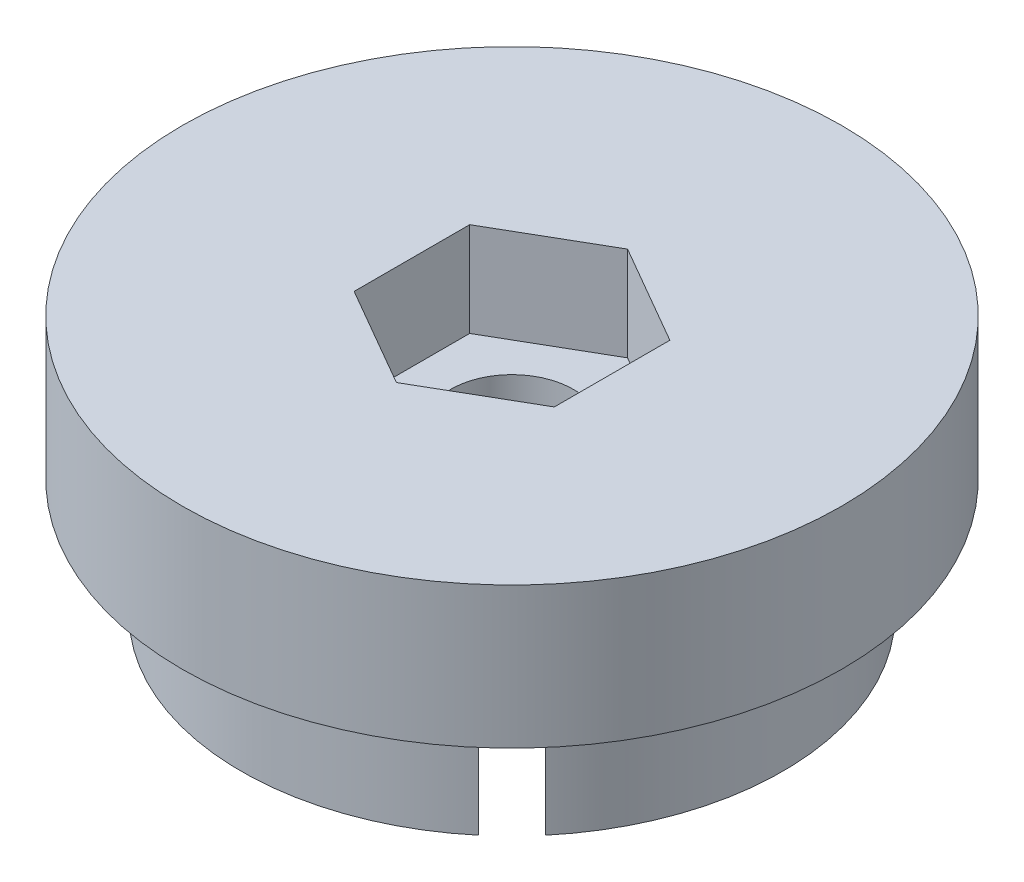
ISO-10303-21;
HEADER;
FILE_DESCRIPTION(('STEP AP214'),'2;1');
FILE_NAME('part.step','',(''),(''),'','','');
FILE_SCHEMA(('AUTOMOTIVE_DESIGN { 1 0 10303 214 1 1 1 1 }'));
ENDSEC;
DATA;
#1=APPLICATION_CONTEXT('core data for automotive mechanical design processes');
#2=APPLICATION_PROTOCOL_DEFINITION('international standard','automotive_design',2000,#1);
#3=PRODUCT_CONTEXT('',#1,'mechanical');
#4=PRODUCT('Part','Part','',(#3));
#5=PRODUCT_RELATED_PRODUCT_CATEGORY('part','',(#4));
#6=PRODUCT_DEFINITION_FORMATION('','',#4);
#7=PRODUCT_DEFINITION_CONTEXT('part definition',#1,'design');
#8=PRODUCT_DEFINITION('design','',#6,#7);
#9=PRODUCT_DEFINITION_SHAPE('','',#8);
#10=(LENGTH_UNIT() NAMED_UNIT(*) SI_UNIT(.MILLI.,.METRE.));
#11=(NAMED_UNIT(*) PLANE_ANGLE_UNIT() SI_UNIT($,.RADIAN.));
#12=(NAMED_UNIT(*) SI_UNIT($,.STERADIAN.) SOLID_ANGLE_UNIT());
#13=UNCERTAINTY_MEASURE_WITH_UNIT(LENGTH_MEASURE(1.E-05),#10,'distance_accuracy_value','');
#14=(GEOMETRIC_REPRESENTATION_CONTEXT(3) GLOBAL_UNCERTAINTY_ASSIGNED_CONTEXT((#13)) GLOBAL_UNIT_ASSIGNED_CONTEXT((#10,
#11,#12)) REPRESENTATION_CONTEXT('',''));
#15=CARTESIAN_POINT('',(0.,0.,0.));
#16=DIRECTION('',(0.,0.,1.));
#17=DIRECTION('',(1.,0.,0.));
#18=AXIS2_PLACEMENT_3D('',#15,#16,#17);
#19=CARTESIAN_POINT('',(0.,0.,0.));
#20=DIRECTION('',(0.,1.,0.));
#21=DIRECTION('',(0.,0.,1.));
#22=AXIS2_PLACEMENT_3D('',#19,#20,#21);
#23=PLANE('',#22);
#24=DIRECTION('',(-0.707106781186548,0.,0.707106781186547));
#25=VECTOR('',#24,1.);
#26=CARTESIAN_POINT('',(-0.707106781186547,0.,-0.707106781186548));
#27=LINE('',#26,#25);
#28=CARTESIAN_POINT('',(-5.53921356237309,0.,4.125));
#29=VERTEX_POINT('',#28);
#30=CARTESIAN_POINT('',(-8.80803265419637,0.,7.39381909182328));
#31=VERTEX_POINT('',#30);
#32=EDGE_CURVE('E344',#29,#31,#27,.T.);
#33=ORIENTED_EDGE('',*,*,#32,.F.);
#34=DIRECTION('',(0.,0.,-1.));
#35=VECTOR('',#34,1.);
#36=CARTESIAN_POINT('',(-5.53921356237309,0.,0.));
#37=LINE('',#36,#35);
#38=CARTESIAN_POINT('',(-5.53921356237309,0.,-4.125));
#39=VERTEX_POINT('',#38);
#40=EDGE_CURVE('E363',#29,#39,#37,.T.);
#41=ORIENTED_EDGE('',*,*,#40,.T.);
#42=DIRECTION('',(0.707106781186546,0.,0.707106781186549));
#43=VECTOR('',#42,1.);
#44=CARTESIAN_POINT('',(-0.707106781186557,0.,0.707106781186554));
#45=LINE('',#44,#43);
#46=CARTESIAN_POINT('',(-8.80803265419637,0.,-7.39381909182329));
#47=VERTEX_POINT('',#46);
#48=EDGE_CURVE('E158',#47,#39,#45,.T.);
#49=ORIENTED_EDGE('',*,*,#48,.F.);
#50=CARTESIAN_POINT('',(0.,0.,0.));
#51=DIRECTION('',(0.,-1.,0.));
#52=DIRECTION('',(0.,0.,-1.));
#53=AXIS2_PLACEMENT_3D('',#50,#51,#52);
#54=CIRCLE('',#53,11.5);
#55=EDGE_CURVE('E359',#31,#47,#54,.T.);
#56=ORIENTED_EDGE('',*,*,#55,.F.);
#57=EDGE_LOOP('',(#33,#41,#49,#56));
#58=FACE_BOUND('',#57,.T.);
#59=DIRECTION('',(0.707106781186548,0.,-0.707106781186548));
#60=VECTOR('',#59,1.);
#61=CARTESIAN_POINT('',(0.707106781186549,0.,0.707106781186549));
#62=LINE('',#61,#60);
#63=CARTESIAN_POINT('',(5.5392135623731,0.,-4.125));
#64=VERTEX_POINT('',#63);
#65=CARTESIAN_POINT('',(8.80803265419637,0.,-7.39381909182327));
#66=VERTEX_POINT('',#65);
#67=EDGE_CURVE('E405',#64,#66,#62,.T.);
#68=ORIENTED_EDGE('',*,*,#67,.F.);
#69=DIRECTION('',(0.,0.,1.));
#70=VECTOR('',#69,1.);
#71=CARTESIAN_POINT('',(5.5392135623731,0.,0.));
#72=LINE('',#71,#70);
#73=CARTESIAN_POINT('',(5.5392135623731,0.,4.125));
#74=VERTEX_POINT('',#73);
#75=EDGE_CURVE('E424',#64,#74,#72,.T.);
#76=ORIENTED_EDGE('',*,*,#75,.T.);
#77=DIRECTION('',(-0.707106781186546,0.,-0.707106781186549));
#78=VECTOR('',#77,1.);
#79=CARTESIAN_POINT('',(0.707106781186556,0.,-0.707106781186554));
#80=LINE('',#79,#78);
#81=CARTESIAN_POINT('',(8.80803265419637,0.,7.39381909182328));
#82=VERTEX_POINT('',#81);
#83=EDGE_CURVE('E422',#82,#74,#80,.T.);
#84=ORIENTED_EDGE('',*,*,#83,.F.);
#85=CARTESIAN_POINT('',(0.,0.,0.));
#86=DIRECTION('',(0.,-1.,0.));
#87=DIRECTION('',(0.,0.,-1.));
#88=AXIS2_PLACEMENT_3D('',#85,#86,#87);
#89=CIRCLE('',#88,11.5);
#90=EDGE_CURVE('E419',#66,#82,#89,.T.);
#91=ORIENTED_EDGE('',*,*,#90,.F.);
#92=EDGE_LOOP('',(#68,#76,#84,#91));
#93=FACE_BOUND('',#92,.T.);
#94=CARTESIAN_POINT('',(0.,0.,0.));
#95=DIRECTION('',(0.,1.,0.));
#96=DIRECTION('',(0.,0.,1.));
#97=AXIS2_PLACEMENT_3D('',#94,#95,#96);
#98=CIRCLE('',#97,14.);
#99=CARTESIAN_POINT('',(0.,0.,14.));
#100=VERTEX_POINT('',#99);
#101=EDGE_CURVE('E488',#100,#100,#98,.T.);
#102=ORIENTED_EDGE('',*,*,#101,.F.);
#103=EDGE_LOOP('',(#102));
#104=FACE_BOUND('',#103,.T.);
#105=DIRECTION('',(-1.,0.,0.));
#106=VECTOR('',#105,1.);
#107=CARTESIAN_POINT('',(3.,0.,-3.));
#108=LINE('',#107,#106);
#109=CARTESIAN_POINT('',(3.,0.,-3.));
#110=VERTEX_POINT('',#109);
#111=CARTESIAN_POINT('',(-3.,0.,-3.));
#112=VERTEX_POINT('',#111);
#113=EDGE_CURVE('E498',#110,#112,#108,.T.);
#114=ORIENTED_EDGE('',*,*,#113,.T.);
#115=DIRECTION('',(0.,0.,1.));
#116=VECTOR('',#115,1.);
#117=CARTESIAN_POINT('',(-3.,0.,3.));
#118=LINE('',#117,#116);
#119=CARTESIAN_POINT('',(-3.,0.,3.));
#120=VERTEX_POINT('',#119);
#121=EDGE_CURVE('E493',#112,#120,#118,.T.);
#122=ORIENTED_EDGE('',*,*,#121,.T.);
#123=DIRECTION('',(1.,0.,0.));
#124=VECTOR('',#123,1.);
#125=CARTESIAN_POINT('',(3.,0.,3.));
#126=LINE('',#125,#124);
#127=CARTESIAN_POINT('',(3.,0.,3.));
#128=VERTEX_POINT('',#127);
#129=EDGE_CURVE('E510',#120,#128,#126,.T.);
#130=ORIENTED_EDGE('',*,*,#129,.T.);
#131=DIRECTION('',(0.,0.,-1.));
#132=VECTOR('',#131,1.);
#133=CARTESIAN_POINT('',(3.,0.,3.));
#134=LINE('',#133,#132);
#135=EDGE_CURVE('E513',#128,#110,#134,.T.);
#136=ORIENTED_EDGE('',*,*,#135,.T.);
#137=EDGE_LOOP('',(#114,#122,#130,#136));
#138=FACE_BOUND('',#137,.T.);
#139=DIRECTION('',(-0.707106781186547,0.,-0.707106781186548));
#140=VECTOR('',#139,1.);
#141=CARTESIAN_POINT('',(0.707106781186547,0.,-0.707106781186547));
#142=LINE('',#141,#140);
#143=CARTESIAN_POINT('',(-4.125,0.,-5.5392135623731));
#144=VERTEX_POINT('',#143);
#145=CARTESIAN_POINT('',(-7.39381909182327,0.,-8.80803265419637));
#146=VERTEX_POINT('',#145);
#147=EDGE_CURVE('E374',#144,#146,#142,.T.);
#148=ORIENTED_EDGE('',*,*,#147,.F.);
#149=DIRECTION('',(1.,0.,0.));
#150=VECTOR('',#149,1.);
#151=CARTESIAN_POINT('',(0.,0.,-5.5392135623731));
#152=LINE('',#151,#150);
#153=CARTESIAN_POINT('',(4.125,0.,-5.53921356237309));
#154=VERTEX_POINT('',#153);
#155=EDGE_CURVE('E393',#144,#154,#152,.T.);
#156=ORIENTED_EDGE('',*,*,#155,.T.);
#157=DIRECTION('',(-0.707106781186549,0.,0.707106781186546));
#158=VECTOR('',#157,1.);
#159=CARTESIAN_POINT('',(-0.707106781186552,0.,-0.707106781186554));
#160=LINE('',#159,#158);
#161=CARTESIAN_POINT('',(7.39381909182329,0.,-8.80803265419637));
#162=VERTEX_POINT('',#161);
#163=EDGE_CURVE('E391',#162,#154,#160,.T.);
#164=ORIENTED_EDGE('',*,*,#163,.F.);
#165=CARTESIAN_POINT('',(0.,0.,0.));
#166=DIRECTION('',(0.,-1.,0.));
#167=DIRECTION('',(0.,0.,-1.));
#168=AXIS2_PLACEMENT_3D('',#165,#166,#167);
#169=CIRCLE('',#168,11.5);
#170=EDGE_CURVE('E388',#146,#162,#169,.T.);
#171=ORIENTED_EDGE('',*,*,#170,.F.);
#172=EDGE_LOOP('',(#148,#156,#164,#171));
#173=FACE_BOUND('',#172,.T.);
#174=DIRECTION('',(0.707106781186547,0.,0.707106781186548));
#175=VECTOR('',#174,1.);
#176=CARTESIAN_POINT('',(-0.707106781186547,0.,0.707106781186546));
#177=LINE('',#176,#175);
#178=CARTESIAN_POINT('',(4.125,0.,5.53921356237309));
#179=VERTEX_POINT('',#178);
#180=CARTESIAN_POINT('',(7.39381909182327,0.,8.80803265419637));
#181=VERTEX_POINT('',#180);
#182=EDGE_CURVE('E324',#179,#181,#177,.T.);
#183=ORIENTED_EDGE('',*,*,#182,.F.);
#184=DIRECTION('',(-1.,0.,0.));
#185=VECTOR('',#184,1.);
#186=CARTESIAN_POINT('',(0.,0.,5.53921356237309));
#187=LINE('',#186,#185);
#188=CARTESIAN_POINT('',(-4.125,0.,5.5392135623731));
#189=VERTEX_POINT('',#188);
#190=EDGE_CURVE('E333',#179,#189,#187,.T.);
#191=ORIENTED_EDGE('',*,*,#190,.T.);
#192=DIRECTION('',(0.707106781186549,0.,-0.707106781186546));
#193=VECTOR('',#192,1.);
#194=CARTESIAN_POINT('',(0.707106781186554,0.,0.707106781186557));
#195=LINE('',#194,#193);
#196=CARTESIAN_POINT('',(-7.39381909182328,0.,8.80803265419637));
#197=VERTEX_POINT('',#196);
#198=EDGE_CURVE('E150',#197,#189,#195,.T.);
#199=ORIENTED_EDGE('',*,*,#198,.F.);
#200=CARTESIAN_POINT('',(0.,0.,0.));
#201=DIRECTION('',(0.,-1.,0.));
#202=DIRECTION('',(0.,0.,-1.));
#203=AXIS2_PLACEMENT_3D('',#200,#201,#202);
#204=CIRCLE('',#203,11.5);
#205=EDGE_CURVE('E316',#181,#197,#204,.T.);
#206=ORIENTED_EDGE('',*,*,#205,.F.);
#207=EDGE_LOOP('',(#183,#191,#199,#206));
#208=FACE_BOUND('',#207,.T.);
#209=ADVANCED_FACE('F133',(#58,#93,#104,#138,#173,#208),#23,.F.);
#210=CARTESIAN_POINT('',(0.,-5.,0.));
#211=DIRECTION('',(0.,1.,0.));
#212=DIRECTION('',(0.,0.,1.));
#213=AXIS2_PLACEMENT_3D('',#210,#211,#212);
#214=CYLINDRICAL_SURFACE('',#213,2.6);
#215=CARTESIAN_POINT('',(0.,-5.,0.));
#216=DIRECTION('',(0.,1.,0.));
#217=DIRECTION('',(0.,0.,1.));
#218=AXIS2_PLACEMENT_3D('',#215,#216,#217);
#219=CIRCLE('',#218,2.6);
#220=CARTESIAN_POINT('',(0.,-5.,2.6));
#221=VERTEX_POINT('',#220);
#222=EDGE_CURVE('E487',#221,#221,#219,.T.);
#223=ORIENTED_EDGE('',*,*,#222,.F.);
#224=EDGE_LOOP('',(#223));
#225=FACE_BOUND('',#224,.T.);
#226=CARTESIAN_POINT('',(0.,2.,0.));
#227=DIRECTION('',(0.,1.,0.));
#228=DIRECTION('',(0.,0.,1.));
#229=AXIS2_PLACEMENT_3D('',#226,#227,#228);
#230=CIRCLE('',#229,2.6);
#231=CARTESIAN_POINT('',(0.,2.,2.6));
#232=VERTEX_POINT('',#231);
#233=EDGE_CURVE('E137',#232,#232,#230,.F.);
#234=ORIENTED_EDGE('',*,*,#233,.F.);
#235=EDGE_LOOP('',(#234));
#236=FACE_BOUND('',#235,.T.);
#237=ADVANCED_FACE('F546',(#225,#236),#214,.F.);
#238=CARTESIAN_POINT('',(-3.,-5.,3.));
#239=DIRECTION('',(-1.,0.,0.));
#240=DIRECTION('',(0.,0.,1.));
#241=AXIS2_PLACEMENT_3D('',#238,#239,#240);
#242=PLANE('',#241);
#243=ORIENTED_EDGE('',*,*,#121,.F.);
#244=DIRECTION('',(0.,1.,0.));
#245=VECTOR('',#244,1.);
#246=CARTESIAN_POINT('',(-3.,-5.,-3.));
#247=LINE('',#246,#245);
#248=CARTESIAN_POINT('',(-3.,-5.,-3.));
#249=VERTEX_POINT('',#248);
#250=EDGE_CURVE('E12',#249,#112,#247,.T.);
#251=ORIENTED_EDGE('',*,*,#250,.F.);
#252=DIRECTION('',(0.,0.,1.));
#253=VECTOR('',#252,1.);
#254=CARTESIAN_POINT('',(-3.,-5.,3.));
#255=LINE('',#254,#253);
#256=CARTESIAN_POINT('',(-3.,-5.,3.));
#257=VERTEX_POINT('',#256);
#258=EDGE_CURVE('E494',#249,#257,#255,.T.);
#259=ORIENTED_EDGE('',*,*,#258,.T.);
#260=DIRECTION('',(0.,1.,0.));
#261=VECTOR('',#260,1.);
#262=CARTESIAN_POINT('',(-3.,-5.,3.));
#263=LINE('',#262,#261);
#264=EDGE_CURVE('E507',#257,#120,#263,.T.);
#265=ORIENTED_EDGE('',*,*,#264,.T.);
#266=EDGE_LOOP('',(#243,#251,#259,#265));
#267=FACE_BOUND('',#266,.T.);
#268=ADVANCED_FACE('F135',(#267),#242,.T.);
#269=CARTESIAN_POINT('',(3.,-5.,-3.));
#270=DIRECTION('',(0.,0.,-1.));
#271=DIRECTION('',(-1.,0.,0.));
#272=AXIS2_PLACEMENT_3D('',#269,#270,#271);
#273=PLANE('',#272);
#274=ORIENTED_EDGE('',*,*,#113,.F.);
#275=DIRECTION('',(0.,1.,0.));
#276=VECTOR('',#275,1.);
#277=CARTESIAN_POINT('',(3.,-5.,-3.));
#278=LINE('',#277,#276);
#279=CARTESIAN_POINT('',(3.,-5.,-3.));
#280=VERTEX_POINT('',#279);
#281=EDGE_CURVE('E142',#280,#110,#278,.T.);
#282=ORIENTED_EDGE('',*,*,#281,.F.);
#283=DIRECTION('',(-1.,0.,0.));
#284=VECTOR('',#283,1.);
#285=CARTESIAN_POINT('',(3.,-5.,-3.));
#286=LINE('',#285,#284);
#287=EDGE_CURVE('E504',#280,#249,#286,.T.);
#288=ORIENTED_EDGE('',*,*,#287,.T.);
#289=ORIENTED_EDGE('',*,*,#250,.T.);
#290=EDGE_LOOP('',(#274,#282,#288,#289));
#291=FACE_BOUND('',#290,.T.);
#292=ADVANCED_FACE('F531',(#291),#273,.T.);
#293=CARTESIAN_POINT('',(3.,-5.,3.));
#294=DIRECTION('',(1.,0.,0.));
#295=DIRECTION('',(0.,0.,-1.));
#296=AXIS2_PLACEMENT_3D('',#293,#294,#295);
#297=PLANE('',#296);
#298=ORIENTED_EDGE('',*,*,#135,.F.);
#299=DIRECTION('',(0.,1.,0.));
#300=VECTOR('',#299,1.);
#301=CARTESIAN_POINT('',(3.,-5.,3.));
#302=LINE('',#301,#300);
#303=CARTESIAN_POINT('',(3.,-5.,3.));
#304=VERTEX_POINT('',#303);
#305=EDGE_CURVE('E519',#304,#128,#302,.T.);
#306=ORIENTED_EDGE('',*,*,#305,.F.);
#307=DIRECTION('',(0.,0.,-1.));
#308=VECTOR('',#307,1.);
#309=CARTESIAN_POINT('',(3.,-5.,3.));
#310=LINE('',#309,#308);
#311=EDGE_CURVE('E501',#304,#280,#310,.T.);
#312=ORIENTED_EDGE('',*,*,#311,.T.);
#313=ORIENTED_EDGE('',*,*,#281,.T.);
#314=EDGE_LOOP('',(#298,#306,#312,#313));
#315=FACE_BOUND('',#314,.T.);
#316=ADVANCED_FACE('F537',(#315),#297,.T.);
#317=CARTESIAN_POINT('',(3.,-5.,3.));
#318=DIRECTION('',(0.,0.,1.));
#319=DIRECTION('',(1.,0.,0.));
#320=AXIS2_PLACEMENT_3D('',#317,#318,#319);
#321=PLANE('',#320);
#322=ORIENTED_EDGE('',*,*,#129,.F.);
#323=ORIENTED_EDGE('',*,*,#264,.F.);
#324=DIRECTION('',(1.,0.,0.));
#325=VECTOR('',#324,1.);
#326=CARTESIAN_POINT('',(3.,-5.,3.));
#327=LINE('',#326,#325);
#328=EDGE_CURVE('E497',#257,#304,#327,.T.);
#329=ORIENTED_EDGE('',*,*,#328,.T.);
#330=ORIENTED_EDGE('',*,*,#305,.T.);
#331=EDGE_LOOP('',(#322,#323,#329,#330));
#332=FACE_BOUND('',#331,.T.);
#333=ADVANCED_FACE('F525',(#332),#321,.T.);
#334=CARTESIAN_POINT('',(0.,-5.,0.));
#335=DIRECTION('',(0.,1.,0.));
#336=DIRECTION('',(0.,0.,1.));
#337=AXIS2_PLACEMENT_3D('',#334,#335,#336);
#338=PLANE('',#337);
#339=ORIENTED_EDGE('',*,*,#222,.T.);
#340=EDGE_LOOP('',(#339));
#341=FACE_BOUND('',#340,.T.);
#342=ORIENTED_EDGE('',*,*,#258,.F.);
#343=ORIENTED_EDGE('',*,*,#287,.F.);
#344=ORIENTED_EDGE('',*,*,#311,.F.);
#345=ORIENTED_EDGE('',*,*,#328,.F.);
#346=EDGE_LOOP('',(#342,#343,#344,#345));
#347=FACE_BOUND('',#346,.T.);
#348=ADVANCED_FACE('F534',(#341,#347),#338,.F.);
#349=CARTESIAN_POINT('',(0.,6.,0.));
#350=DIRECTION('',(0.,1.,0.));
#351=DIRECTION('',(0.,0.,1.));
#352=AXIS2_PLACEMENT_3D('',#349,#350,#351);
#353=PLANE('',#352);
#354=DIRECTION('',(-0.866025403784438,0.,-0.5));
#355=VECTOR('',#354,1.);
#356=CARTESIAN_POINT('',(4.25,6.,-2.45373864405591));
#357=LINE('',#356,#355);
#358=CARTESIAN_POINT('',(4.25,6.,-2.45373864405591));
#359=VERTEX_POINT('',#358);
#360=CARTESIAN_POINT('',(0.,6.,-4.90747728811182));
#361=VERTEX_POINT('',#360);
#362=EDGE_CURVE('E436',#359,#361,#357,.T.);
#363=ORIENTED_EDGE('',*,*,#362,.F.);
#364=DIRECTION('',(0.,0.,-1.));
#365=VECTOR('',#364,1.);
#366=CARTESIAN_POINT('',(4.25,6.,2.45373864405591));
#367=LINE('',#366,#365);
#368=CARTESIAN_POINT('',(4.25,6.,2.45373864405591));
#369=VERTEX_POINT('',#368);
#370=EDGE_CURVE('E441',#369,#359,#367,.T.);
#371=ORIENTED_EDGE('',*,*,#370,.F.);
#372=DIRECTION('',(0.866025403784439,0.,-0.5));
#373=VECTOR('',#372,1.);
#374=CARTESIAN_POINT('',(0.,6.,4.90747728811182));
#375=LINE('',#374,#373);
#376=CARTESIAN_POINT('',(0.,6.,4.90747728811182));
#377=VERTEX_POINT('',#376);
#378=EDGE_CURVE('E467',#377,#369,#375,.T.);
#379=ORIENTED_EDGE('',*,*,#378,.F.);
#380=DIRECTION('',(0.866025403784439,0.,0.5));
#381=VECTOR('',#380,1.);
#382=CARTESIAN_POINT('',(-4.25,6.,2.45373864405591));
#383=LINE('',#382,#381);
#384=CARTESIAN_POINT('',(-4.25,6.,2.45373864405591));
#385=VERTEX_POINT('',#384);
#386=EDGE_CURVE('E464',#385,#377,#383,.T.);
#387=ORIENTED_EDGE('',*,*,#386,.F.);
#388=DIRECTION('',(0.,0.,1.));
#389=VECTOR('',#388,1.);
#390=CARTESIAN_POINT('',(-4.25,6.,-2.45373864405591));
#391=LINE('',#390,#389);
#392=CARTESIAN_POINT('',(-4.25,6.,-2.45373864405591));
#393=VERTEX_POINT('',#392);
#394=EDGE_CURVE('E461',#393,#385,#391,.T.);
#395=ORIENTED_EDGE('',*,*,#394,.F.);
#396=DIRECTION('',(-0.866025403784439,0.,0.5));
#397=VECTOR('',#396,1.);
#398=CARTESIAN_POINT('',(0.,6.,-4.90747728811182));
#399=LINE('',#398,#397);
#400=EDGE_CURVE('E458',#361,#393,#399,.T.);
#401=ORIENTED_EDGE('',*,*,#400,.F.);
#402=EDGE_LOOP('',(#363,#371,#379,#387,#395,#401));
#403=FACE_BOUND('',#402,.T.);
#404=CARTESIAN_POINT('',(0.,6.,0.));
#405=DIRECTION('',(0.,1.,0.));
#406=DIRECTION('',(0.,0.,1.));
#407=AXIS2_PLACEMENT_3D('',#404,#405,#406);
#408=CIRCLE('',#407,14.);
#409=CARTESIAN_POINT('',(0.,6.,14.));
#410=VERTEX_POINT('',#409);
#411=EDGE_CURVE('E484',#410,#410,#408,.T.);
#412=ORIENTED_EDGE('',*,*,#411,.T.);
#413=EDGE_LOOP('',(#412));
#414=FACE_BOUND('',#413,.T.);
#415=ADVANCED_FACE('F558',(#403,#414),#353,.T.);
#416=CARTESIAN_POINT('',(0.,6.,0.));
#417=DIRECTION('',(0.,-1.,0.));
#418=DIRECTION('',(0.,0.,-1.));
#419=AXIS2_PLACEMENT_3D('',#416,#417,#418);
#420=CYLINDRICAL_SURFACE('',#419,14.);
#421=ORIENTED_EDGE('',*,*,#411,.F.);
#422=EDGE_LOOP('',(#421));
#423=FACE_BOUND('',#422,.T.);
#424=ORIENTED_EDGE('',*,*,#101,.T.);
#425=EDGE_LOOP('',(#424));
#426=FACE_BOUND('',#425,.T.);
#427=ADVANCED_FACE('F560',(#423,#426),#420,.T.);
#428=CARTESIAN_POINT('',(0.,2.,0.));
#429=DIRECTION('',(0.,1.,0.));
#430=DIRECTION('',(0.,0.,1.));
#431=AXIS2_PLACEMENT_3D('',#428,#429,#430);
#432=PLANE('',#431);
#433=DIRECTION('',(-0.866025403784438,0.,-0.5));
#434=VECTOR('',#433,1.);
#435=CARTESIAN_POINT('',(4.25,2.,-2.45373864405591));
#436=LINE('',#435,#434);
#437=CARTESIAN_POINT('',(4.25,2.,-2.45373864405591));
#438=VERTEX_POINT('',#437);
#439=CARTESIAN_POINT('',(0.,2.,-4.90747728811182));
#440=VERTEX_POINT('',#439);
#441=EDGE_CURVE('E437',#438,#440,#436,.T.);
#442=ORIENTED_EDGE('',*,*,#441,.T.);
#443=DIRECTION('',(-0.866025403784439,0.,0.5));
#444=VECTOR('',#443,1.);
#445=CARTESIAN_POINT('',(0.,2.,-4.90747728811182));
#446=LINE('',#445,#444);
#447=CARTESIAN_POINT('',(-4.25,2.,-2.45373864405591));
#448=VERTEX_POINT('',#447);
#449=EDGE_CURVE('E440',#440,#448,#446,.T.);
#450=ORIENTED_EDGE('',*,*,#449,.T.);
#451=DIRECTION('',(0.,0.,1.));
#452=VECTOR('',#451,1.);
#453=CARTESIAN_POINT('',(-4.25,2.,-2.45373864405591));
#454=LINE('',#453,#452);
#455=CARTESIAN_POINT('',(-4.25,2.,2.45373864405591));
#456=VERTEX_POINT('',#455);
#457=EDGE_CURVE('E444',#448,#456,#454,.T.);
#458=ORIENTED_EDGE('',*,*,#457,.T.);
#459=DIRECTION('',(0.866025403784439,0.,0.5));
#460=VECTOR('',#459,1.);
#461=CARTESIAN_POINT('',(-4.25,2.,2.45373864405591));
#462=LINE('',#461,#460);
#463=CARTESIAN_POINT('',(0.,2.,4.90747728811182));
#464=VERTEX_POINT('',#463);
#465=EDGE_CURVE('E447',#456,#464,#462,.T.);
#466=ORIENTED_EDGE('',*,*,#465,.T.);
#467=DIRECTION('',(0.866025403784439,0.,-0.5));
#468=VECTOR('',#467,1.);
#469=CARTESIAN_POINT('',(0.,2.,4.90747728811182));
#470=LINE('',#469,#468);
#471=CARTESIAN_POINT('',(4.25,2.,2.45373864405591));
#472=VERTEX_POINT('',#471);
#473=EDGE_CURVE('E450',#464,#472,#470,.T.);
#474=ORIENTED_EDGE('',*,*,#473,.T.);
#475=DIRECTION('',(0.,0.,-1.));
#476=VECTOR('',#475,1.);
#477=CARTESIAN_POINT('',(4.25,2.,2.45373864405591));
#478=LINE('',#477,#476);
#479=EDGE_CURVE('E453',#472,#438,#478,.T.);
#480=ORIENTED_EDGE('',*,*,#479,.T.);
#481=EDGE_LOOP('',(#442,#450,#458,#466,#474,#480));
#482=FACE_BOUND('',#481,.T.);
#483=ORIENTED_EDGE('',*,*,#233,.T.);
#484=EDGE_LOOP('',(#483));
#485=FACE_BOUND('',#484,.T.);
#486=ADVANCED_FACE('F562',(#482,#485),#432,.T.);
#487=CARTESIAN_POINT('',(4.25,2.,-2.45373864405591));
#488=DIRECTION('',(0.5,0.,-0.866025403784438));
#489=DIRECTION('',(-0.866025403784439,0.,-0.5));
#490=AXIS2_PLACEMENT_3D('',#487,#488,#489);
#491=PLANE('',#490);
#492=ORIENTED_EDGE('',*,*,#362,.T.);
#493=DIRECTION('',(0.,1.,0.));
#494=VECTOR('',#493,1.);
#495=CARTESIAN_POINT('',(0.,2.,-4.90747728811182));
#496=LINE('',#495,#494);
#497=EDGE_CURVE('E456',#440,#361,#496,.T.);
#498=ORIENTED_EDGE('',*,*,#497,.F.);
#499=ORIENTED_EDGE('',*,*,#441,.F.);
#500=DIRECTION('',(0.,1.,0.));
#501=VECTOR('',#500,1.);
#502=CARTESIAN_POINT('',(4.25,2.,-2.45373864405591));
#503=LINE('',#502,#501);
#504=EDGE_CURVE('E472',#438,#359,#503,.T.);
#505=ORIENTED_EDGE('',*,*,#504,.T.);
#506=EDGE_LOOP('',(#492,#498,#499,#505));
#507=FACE_BOUND('',#506,.T.);
#508=ADVANCED_FACE('F577',(#507),#491,.F.);
#509=CARTESIAN_POINT('',(4.25,2.,2.45373864405591));
#510=DIRECTION('',(1.,0.,0.));
#511=DIRECTION('',(0.,0.,-1.));
#512=AXIS2_PLACEMENT_3D('',#509,#510,#511);
#513=PLANE('',#512);
#514=ORIENTED_EDGE('',*,*,#370,.T.);
#515=ORIENTED_EDGE('',*,*,#504,.F.);
#516=ORIENTED_EDGE('',*,*,#479,.F.);
#517=DIRECTION('',(0.,1.,0.));
#518=VECTOR('',#517,1.);
#519=CARTESIAN_POINT('',(4.25,2.,2.45373864405591));
#520=LINE('',#519,#518);
#521=EDGE_CURVE('E474',#472,#369,#520,.T.);
#522=ORIENTED_EDGE('',*,*,#521,.T.);
#523=EDGE_LOOP('',(#514,#515,#516,#522));
#524=FACE_BOUND('',#523,.T.);
#525=ADVANCED_FACE('F583',(#524),#513,.F.);
#526=CARTESIAN_POINT('',(0.,2.,4.90747728811182));
#527=DIRECTION('',(0.5,0.,0.866025403784439));
#528=DIRECTION('',(0.866025403784439,0.,-0.5));
#529=AXIS2_PLACEMENT_3D('',#526,#527,#528);
#530=PLANE('',#529);
#531=ORIENTED_EDGE('',*,*,#378,.T.);
#532=ORIENTED_EDGE('',*,*,#521,.F.);
#533=ORIENTED_EDGE('',*,*,#473,.F.);
#534=DIRECTION('',(0.,1.,0.));
#535=VECTOR('',#534,1.);
#536=CARTESIAN_POINT('',(0.,2.,4.90747728811182));
#537=LINE('',#536,#535);
#538=EDGE_CURVE('E476',#464,#377,#537,.T.);
#539=ORIENTED_EDGE('',*,*,#538,.T.);
#540=EDGE_LOOP('',(#531,#532,#533,#539));
#541=FACE_BOUND('',#540,.T.);
#542=ADVANCED_FACE('F591',(#541),#530,.F.);
#543=CARTESIAN_POINT('',(-4.25,2.,2.45373864405591));
#544=DIRECTION('',(-0.5,0.,0.866025403784439));
#545=DIRECTION('',(0.866025403784439,0.,0.5));
#546=AXIS2_PLACEMENT_3D('',#543,#544,#545);
#547=PLANE('',#546);
#548=ORIENTED_EDGE('',*,*,#386,.T.);
#549=ORIENTED_EDGE('',*,*,#538,.F.);
#550=ORIENTED_EDGE('',*,*,#465,.F.);
#551=DIRECTION('',(0.,1.,0.));
#552=VECTOR('',#551,1.);
#553=CARTESIAN_POINT('',(-4.25,2.,2.45373864405591));
#554=LINE('',#553,#552);
#555=EDGE_CURVE('E478',#456,#385,#554,.T.);
#556=ORIENTED_EDGE('',*,*,#555,.T.);
#557=EDGE_LOOP('',(#548,#549,#550,#556));
#558=FACE_BOUND('',#557,.T.);
#559=ADVANCED_FACE('F595',(#558),#547,.F.);
#560=CARTESIAN_POINT('',(-4.25,2.,-2.45373864405591));
#561=DIRECTION('',(-1.,0.,0.));
#562=DIRECTION('',(0.,0.,1.));
#563=AXIS2_PLACEMENT_3D('',#560,#561,#562);
#564=PLANE('',#563);
#565=ORIENTED_EDGE('',*,*,#394,.T.);
#566=ORIENTED_EDGE('',*,*,#555,.F.);
#567=ORIENTED_EDGE('',*,*,#457,.F.);
#568=DIRECTION('',(0.,1.,0.));
#569=VECTOR('',#568,1.);
#570=CARTESIAN_POINT('',(-4.25,2.,-2.45373864405591));
#571=LINE('',#570,#569);
#572=EDGE_CURVE('E480',#448,#393,#571,.T.);
#573=ORIENTED_EDGE('',*,*,#572,.T.);
#574=EDGE_LOOP('',(#565,#566,#567,#573));
#575=FACE_BOUND('',#574,.T.);
#576=ADVANCED_FACE('F599',(#575),#564,.F.);
#577=CARTESIAN_POINT('',(0.,2.,-4.90747728811182));
#578=DIRECTION('',(-0.5,0.,-0.866025403784439));
#579=DIRECTION('',(-0.866025403784439,0.,0.5));
#580=AXIS2_PLACEMENT_3D('',#577,#578,#579);
#581=PLANE('',#580);
#582=ORIENTED_EDGE('',*,*,#400,.T.);
#583=ORIENTED_EDGE('',*,*,#572,.F.);
#584=ORIENTED_EDGE('',*,*,#449,.F.);
#585=ORIENTED_EDGE('',*,*,#497,.T.);
#586=EDGE_LOOP('',(#582,#583,#584,#585));
#587=FACE_BOUND('',#586,.T.);
#588=ADVANCED_FACE('F603',(#587),#581,.F.);
#589=CARTESIAN_POINT('',(0.707106781186549,-20.9438144120357,0.707106781186549));
#590=DIRECTION('',(0.707106781186548,0.,0.707106781186548));
#591=DIRECTION('',(0.707106781186548,0.,-0.707106781186548));
#592=AXIS2_PLACEMENT_3D('',#589,#590,#591);
#593=PLANE('',#592);
#594=DIRECTION('',(0.,1.,0.));
#595=VECTOR('',#594,1.);
#596=CARTESIAN_POINT('',(8.80803265419637,-20.9438144120357,-7.39381909182327));
#597=LINE('',#596,#595);
#598=CARTESIAN_POINT('',(8.80803265419637,-5.,-7.39381909182328));
#599=VERTEX_POINT('',#598);
#600=EDGE_CURVE('E410',#599,#66,#597,.T.);
#601=ORIENTED_EDGE('',*,*,#600,.F.);
#602=DIRECTION('',(-0.707106781186548,0.,0.707106781186548));
#603=VECTOR('',#602,1.);
#604=CARTESIAN_POINT('',(0.707106781186549,-5.,0.707106781186549));
#605=LINE('',#604,#603);
#606=CARTESIAN_POINT('',(5.5392135623731,-5.,-4.125));
#607=VERTEX_POINT('',#606);
#608=EDGE_CURVE('E413',#599,#607,#605,.T.);
#609=ORIENTED_EDGE('',*,*,#608,.T.);
#610=DIRECTION('',(0.,1.,0.));
#611=VECTOR('',#610,1.);
#612=CARTESIAN_POINT('',(5.5392135623731,-20.9438144120357,-4.125));
#613=LINE('',#612,#611);
#614=EDGE_CURVE('E427',#607,#64,#613,.T.);
#615=ORIENTED_EDGE('',*,*,#614,.T.);
#616=ORIENTED_EDGE('',*,*,#67,.T.);
#617=EDGE_LOOP('',(#601,#609,#615,#616));
#618=FACE_BOUND('',#617,.T.);
#619=ADVANCED_FACE('F587',(#618),#593,.F.);
#620=CARTESIAN_POINT('',(0.,-20.9438144120357,0.));
#621=DIRECTION('',(0.,1.,0.));
#622=DIRECTION('',(0.,0.,1.));
#623=AXIS2_PLACEMENT_3D('',#620,#621,#622);
#624=CYLINDRICAL_SURFACE('',#623,11.5);
#625=DIRECTION('',(0.,1.,0.));
#626=VECTOR('',#625,1.);
#627=CARTESIAN_POINT('',(8.80803265419637,-20.9438144120357,7.39381909182328));
#628=LINE('',#627,#626);
#629=CARTESIAN_POINT('',(8.80803265419636,-5.,7.39381909182328));
#630=VERTEX_POINT('',#629);
#631=EDGE_CURVE('E432',#630,#82,#628,.T.);
#632=ORIENTED_EDGE('',*,*,#631,.F.);
#633=CARTESIAN_POINT('',(0.,-5.,0.));
#634=DIRECTION('',(0.,1.,0.));
#635=DIRECTION('',(0.,0.,1.));
#636=AXIS2_PLACEMENT_3D('',#633,#634,#635);
#637=CIRCLE('',#636,11.5);
#638=EDGE_CURVE('E409',#630,#599,#637,.T.);
#639=ORIENTED_EDGE('',*,*,#638,.T.);
#640=ORIENTED_EDGE('',*,*,#600,.T.);
#641=ORIENTED_EDGE('',*,*,#90,.T.);
#642=EDGE_LOOP('',(#632,#639,#640,#641));
#643=FACE_BOUND('',#642,.T.);
#644=ADVANCED_FACE('F610',(#643),#624,.T.);
#645=CARTESIAN_POINT('',(0.707106781186556,-20.9438144120357,-0.707106781186554));
#646=DIRECTION('',(0.707106781186549,0.,-0.707106781186546));
#647=DIRECTION('',(-0.707106781186546,0.,-0.707106781186549));
#648=AXIS2_PLACEMENT_3D('',#645,#646,#647);
#649=PLANE('',#648);
#650=DIRECTION('',(0.,1.,0.));
#651=VECTOR('',#650,1.);
#652=CARTESIAN_POINT('',(5.5392135623731,-20.9438144120357,4.125));
#653=LINE('',#652,#651);
#654=CARTESIAN_POINT('',(5.5392135623731,-5.,4.125));
#655=VERTEX_POINT('',#654);
#656=EDGE_CURVE('E429',#655,#74,#653,.T.);
#657=ORIENTED_EDGE('',*,*,#656,.F.);
#658=DIRECTION('',(0.707106781186546,0.,0.707106781186549));
#659=VECTOR('',#658,1.);
#660=CARTESIAN_POINT('',(0.707106781186556,-5.,-0.707106781186554));
#661=LINE('',#660,#659);
#662=EDGE_CURVE('E406',#655,#630,#661,.T.);
#663=ORIENTED_EDGE('',*,*,#662,.T.);
#664=ORIENTED_EDGE('',*,*,#631,.T.);
#665=ORIENTED_EDGE('',*,*,#83,.T.);
#666=EDGE_LOOP('',(#657,#663,#664,#665));
#667=FACE_BOUND('',#666,.T.);
#668=ADVANCED_FACE('F632',(#667),#649,.F.);
#669=CARTESIAN_POINT('',(5.5392135623731,-20.9438144120357,0.));
#670=DIRECTION('',(-1.,0.,0.));
#671=DIRECTION('',(0.,0.,1.));
#672=AXIS2_PLACEMENT_3D('',#669,#670,#671);
#673=PLANE('',#672);
#674=DIRECTION('',(0.,0.,-1.));
#675=VECTOR('',#674,1.);
#676=CARTESIAN_POINT('',(5.5392135623731,-5.,0.));
#677=LINE('',#676,#675);
#678=EDGE_CURVE('E416',#655,#607,#677,.T.);
#679=ORIENTED_EDGE('',*,*,#678,.F.);
#680=ORIENTED_EDGE('',*,*,#656,.T.);
#681=ORIENTED_EDGE('',*,*,#75,.F.);
#682=ORIENTED_EDGE('',*,*,#614,.F.);
#683=EDGE_LOOP('',(#679,#680,#681,#682));
#684=FACE_BOUND('',#683,.T.);
#685=ADVANCED_FACE('F647',(#684),#673,.T.);
#686=CARTESIAN_POINT('',(0.,-5.,0.));
#687=DIRECTION('',(0.,1.,0.));
#688=DIRECTION('',(0.,0.,1.));
#689=AXIS2_PLACEMENT_3D('',#686,#687,#688);
#690=PLANE('',#689);
#691=ORIENTED_EDGE('',*,*,#638,.F.);
#692=ORIENTED_EDGE('',*,*,#662,.F.);
#693=ORIENTED_EDGE('',*,*,#678,.T.);
#694=ORIENTED_EDGE('',*,*,#608,.F.);
#695=EDGE_LOOP('',(#691,#692,#693,#694));
#696=FACE_BOUND('',#695,.T.);
#697=ADVANCED_FACE('F641',(#696),#690,.F.);
#698=CARTESIAN_POINT('',(0.707106781186547,-20.9438144120357,-0.707106781186547));
#699=DIRECTION('',(0.707106781186548,0.,-0.707106781186547));
#700=DIRECTION('',(-0.707106781186547,0.,-0.707106781186548));
#701=AXIS2_PLACEMENT_3D('',#698,#699,#700);
#702=PLANE('',#701);
#703=DIRECTION('',(0.,1.,0.));
#704=VECTOR('',#703,1.);
#705=CARTESIAN_POINT('',(-7.39381909182327,-20.9438144120357,-8.80803265419637));
#706=LINE('',#705,#704);
#707=CARTESIAN_POINT('',(-7.39381909182328,-5.,-8.80803265419638));
#708=VERTEX_POINT('',#707);
#709=EDGE_CURVE('E379',#708,#146,#706,.T.);
#710=ORIENTED_EDGE('',*,*,#709,.F.);
#711=DIRECTION('',(0.707106781186547,0.,0.707106781186548));
#712=VECTOR('',#711,1.);
#713=CARTESIAN_POINT('',(0.707106781186547,-5.,-0.707106781186547));
#714=LINE('',#713,#712);
#715=CARTESIAN_POINT('',(-4.125,-5.,-5.5392135623731));
#716=VERTEX_POINT('',#715);
#717=EDGE_CURVE('E382',#708,#716,#714,.T.);
#718=ORIENTED_EDGE('',*,*,#717,.T.);
#719=DIRECTION('',(0.,1.,0.));
#720=VECTOR('',#719,1.);
#721=CARTESIAN_POINT('',(-4.125,-20.9438144120357,-5.5392135623731));
#722=LINE('',#721,#720);
#723=EDGE_CURVE('E396',#716,#144,#722,.T.);
#724=ORIENTED_EDGE('',*,*,#723,.T.);
#725=ORIENTED_EDGE('',*,*,#147,.T.);
#726=EDGE_LOOP('',(#710,#718,#724,#725));
#727=FACE_BOUND('',#726,.T.);
#728=ADVANCED_FACE('F654',(#727),#702,.F.);
#729=CARTESIAN_POINT('',(0.,-20.9438144120357,0.));
#730=DIRECTION('',(0.,1.,0.));
#731=DIRECTION('',(0.,0.,1.));
#732=AXIS2_PLACEMENT_3D('',#729,#730,#731);
#733=CYLINDRICAL_SURFACE('',#732,11.5);
#734=DIRECTION('',(0.,1.,0.));
#735=VECTOR('',#734,1.);
#736=CARTESIAN_POINT('',(7.39381909182329,-20.9438144120357,-8.80803265419637));
#737=LINE('',#736,#735);
#738=CARTESIAN_POINT('',(7.39381909182328,-5.,-8.80803265419637));
#739=VERTEX_POINT('',#738);
#740=EDGE_CURVE('E401',#739,#162,#737,.T.);
#741=ORIENTED_EDGE('',*,*,#740,.F.);
#742=CARTESIAN_POINT('',(0.,-5.,0.));
#743=DIRECTION('',(0.,1.,0.));
#744=DIRECTION('',(0.,0.,1.));
#745=AXIS2_PLACEMENT_3D('',#742,#743,#744);
#746=CIRCLE('',#745,11.5);
#747=EDGE_CURVE('E378',#739,#708,#746,.T.);
#748=ORIENTED_EDGE('',*,*,#747,.T.);
#749=ORIENTED_EDGE('',*,*,#709,.T.);
#750=ORIENTED_EDGE('',*,*,#170,.T.);
#751=EDGE_LOOP('',(#741,#748,#749,#750));
#752=FACE_BOUND('',#751,.T.);
#753=ADVANCED_FACE('F660',(#752),#733,.T.);
#754=CARTESIAN_POINT('',(-0.707106781186552,-20.9438144120357,-0.707106781186554));
#755=DIRECTION('',(-0.707106781186546,0.,-0.707106781186548));
#756=DIRECTION('',(-0.707106781186549,0.,0.707106781186547));
#757=AXIS2_PLACEMENT_3D('',#754,#755,#756);
#758=PLANE('',#757);
#759=DIRECTION('',(0.,1.,0.));
#760=VECTOR('',#759,1.);
#761=CARTESIAN_POINT('',(4.125,-20.9438144120357,-5.53921356237309));
#762=LINE('',#761,#760);
#763=CARTESIAN_POINT('',(4.125,-5.,-5.53921356237309));
#764=VERTEX_POINT('',#763);
#765=EDGE_CURVE('E398',#764,#154,#762,.T.);
#766=ORIENTED_EDGE('',*,*,#765,.F.);
#767=DIRECTION('',(0.707106781186549,0.,-0.707106781186547));
#768=VECTOR('',#767,1.);
#769=CARTESIAN_POINT('',(-0.707106781186552,-5.,-0.707106781186554));
#770=LINE('',#769,#768);
#771=EDGE_CURVE('E375',#764,#739,#770,.T.);
#772=ORIENTED_EDGE('',*,*,#771,.T.);
#773=ORIENTED_EDGE('',*,*,#740,.T.);
#774=ORIENTED_EDGE('',*,*,#163,.T.);
#775=EDGE_LOOP('',(#766,#772,#773,#774));
#776=FACE_BOUND('',#775,.T.);
#777=ADVANCED_FACE('F664',(#776),#758,.F.);
#778=CARTESIAN_POINT('',(0.,-20.9438144120357,-5.5392135623731));
#779=DIRECTION('',(0.,0.,1.));
#780=DIRECTION('',(1.,0.,0.));
#781=AXIS2_PLACEMENT_3D('',#778,#779,#780);
#782=PLANE('',#781);
#783=DIRECTION('',(-1.,0.,0.));
#784=VECTOR('',#783,1.);
#785=CARTESIAN_POINT('',(0.,-5.,-5.5392135623731));
#786=LINE('',#785,#784);
#787=EDGE_CURVE('E385',#764,#716,#786,.T.);
#788=ORIENTED_EDGE('',*,*,#787,.F.);
#789=ORIENTED_EDGE('',*,*,#765,.T.);
#790=ORIENTED_EDGE('',*,*,#155,.F.);
#791=ORIENTED_EDGE('',*,*,#723,.F.);
#792=EDGE_LOOP('',(#788,#789,#790,#791));
#793=FACE_BOUND('',#792,.T.);
#794=ADVANCED_FACE('F668',(#793),#782,.T.);
#795=CARTESIAN_POINT('',(0.,-5.,0.));
#796=DIRECTION('',(0.,1.,0.));
#797=DIRECTION('',(0.,0.,1.));
#798=AXIS2_PLACEMENT_3D('',#795,#796,#797);
#799=PLANE('',#798);
#800=ORIENTED_EDGE('',*,*,#747,.F.);
#801=ORIENTED_EDGE('',*,*,#771,.F.);
#802=ORIENTED_EDGE('',*,*,#787,.T.);
#803=ORIENTED_EDGE('',*,*,#717,.F.);
#804=EDGE_LOOP('',(#800,#801,#802,#803));
#805=FACE_BOUND('',#804,.T.);
#806=ADVANCED_FACE('F672',(#805),#799,.F.);
#807=CARTESIAN_POINT('',(-0.707106781186547,-20.9438144120357,-0.707106781186548));
#808=DIRECTION('',(-0.707106781186547,0.,-0.707106781186548));
#809=DIRECTION('',(-0.707106781186548,0.,0.707106781186547));
#810=AXIS2_PLACEMENT_3D('',#807,#808,#809);
#811=PLANE('',#810);
#812=DIRECTION('',(0.,1.,0.));
#813=VECTOR('',#812,1.);
#814=CARTESIAN_POINT('',(-8.80803265419637,-20.9438144120357,7.39381909182328));
#815=LINE('',#814,#813);
#816=CARTESIAN_POINT('',(-8.80803265419637,-5.,7.39381909182328));
#817=VERTEX_POINT('',#816);
#818=EDGE_CURVE('E350',#817,#31,#815,.T.);
#819=ORIENTED_EDGE('',*,*,#818,.F.);
#820=DIRECTION('',(0.707106781186548,0.,-0.707106781186547));
#821=VECTOR('',#820,1.);
#822=CARTESIAN_POINT('',(-0.707106781186547,-5.,-0.707106781186548));
#823=LINE('',#822,#821);
#824=CARTESIAN_POINT('',(-5.53921356237309,-5.,4.125));
#825=VERTEX_POINT('',#824);
#826=EDGE_CURVE('E353',#817,#825,#823,.T.);
#827=ORIENTED_EDGE('',*,*,#826,.T.);
#828=DIRECTION('',(0.,1.,0.));
#829=VECTOR('',#828,1.);
#830=CARTESIAN_POINT('',(-5.53921356237309,-20.9438144120357,4.125));
#831=LINE('',#830,#829);
#832=EDGE_CURVE('E366',#825,#29,#831,.T.);
#833=ORIENTED_EDGE('',*,*,#832,.T.);
#834=ORIENTED_EDGE('',*,*,#32,.T.);
#835=EDGE_LOOP('',(#819,#827,#833,#834));
#836=FACE_BOUND('',#835,.T.);
#837=ADVANCED_FACE('F676',(#836),#811,.F.);
#838=CARTESIAN_POINT('',(0.,-20.9438144120357,0.));
#839=DIRECTION('',(0.,1.,0.));
#840=DIRECTION('',(0.,0.,1.));
#841=AXIS2_PLACEMENT_3D('',#838,#839,#840);
#842=CYLINDRICAL_SURFACE('',#841,11.5);
#843=DIRECTION('',(0.,1.,0.));
#844=VECTOR('',#843,1.);
#845=CARTESIAN_POINT('',(-8.80803265419637,-20.9438144120357,-7.39381909182329));
#846=LINE('',#845,#844);
#847=CARTESIAN_POINT('',(-8.80803265419637,-5.,-7.39381909182328));
#848=VERTEX_POINT('',#847);
#849=EDGE_CURVE('E370',#848,#47,#846,.T.);
#850=ORIENTED_EDGE('',*,*,#849,.F.);
#851=CARTESIAN_POINT('',(0.,-5.,0.));
#852=DIRECTION('',(0.,1.,0.));
#853=DIRECTION('',(0.,0.,1.));
#854=AXIS2_PLACEMENT_3D('',#851,#852,#853);
#855=CIRCLE('',#854,11.5);
#856=EDGE_CURVE('E349',#848,#817,#855,.T.);
#857=ORIENTED_EDGE('',*,*,#856,.T.);
#858=ORIENTED_EDGE('',*,*,#818,.T.);
#859=ORIENTED_EDGE('',*,*,#55,.T.);
#860=EDGE_LOOP('',(#850,#857,#858,#859));
#861=FACE_BOUND('',#860,.T.);
#862=ADVANCED_FACE('F680',(#861),#842,.T.);
#863=CARTESIAN_POINT('',(-0.707106781186557,-20.9438144120357,0.707106781186554));
#864=DIRECTION('',(-0.707106781186549,0.,0.707106781186546));
#865=DIRECTION('',(0.707106781186546,0.,0.707106781186549));
#866=AXIS2_PLACEMENT_3D('',#863,#864,#865);
#867=PLANE('',#866);
#868=DIRECTION('',(0.,1.,0.));
#869=VECTOR('',#868,1.);
#870=CARTESIAN_POINT('',(-5.53921356237309,-20.9438144120357,-4.125));
#871=LINE('',#870,#869);
#872=CARTESIAN_POINT('',(-5.53921356237309,-5.,-4.125));
#873=VERTEX_POINT('',#872);
#874=EDGE_CURVE('E368',#873,#39,#871,.T.);
#875=ORIENTED_EDGE('',*,*,#874,.F.);
#876=DIRECTION('',(-0.707106781186546,0.,-0.707106781186549));
#877=VECTOR('',#876,1.);
#878=CARTESIAN_POINT('',(-0.707106781186557,-5.,0.707106781186554));
#879=LINE('',#878,#877);
#880=EDGE_CURVE('E346',#873,#848,#879,.T.);
#881=ORIENTED_EDGE('',*,*,#880,.T.);
#882=ORIENTED_EDGE('',*,*,#849,.T.);
#883=ORIENTED_EDGE('',*,*,#48,.T.);
#884=EDGE_LOOP('',(#875,#881,#882,#883));
#885=FACE_BOUND('',#884,.T.);
#886=ADVANCED_FACE('F684',(#885),#867,.F.);
#887=CARTESIAN_POINT('',(-5.53921356237309,-20.9438144120357,0.));
#888=DIRECTION('',(1.,0.,0.));
#889=DIRECTION('',(0.,0.,-1.));
#890=AXIS2_PLACEMENT_3D('',#887,#888,#889);
#891=PLANE('',#890);
#892=DIRECTION('',(0.,0.,1.));
#893=VECTOR('',#892,1.);
#894=CARTESIAN_POINT('',(-5.53921356237309,-5.,0.));
#895=LINE('',#894,#893);
#896=EDGE_CURVE('E356',#873,#825,#895,.T.);
#897=ORIENTED_EDGE('',*,*,#896,.F.);
#898=ORIENTED_EDGE('',*,*,#874,.T.);
#899=ORIENTED_EDGE('',*,*,#40,.F.);
#900=ORIENTED_EDGE('',*,*,#832,.F.);
#901=EDGE_LOOP('',(#897,#898,#899,#900));
#902=FACE_BOUND('',#901,.T.);
#903=ADVANCED_FACE('F688',(#902),#891,.T.);
#904=CARTESIAN_POINT('',(0.,-5.,0.));
#905=DIRECTION('',(0.,1.,0.));
#906=DIRECTION('',(0.,0.,1.));
#907=AXIS2_PLACEMENT_3D('',#904,#905,#906);
#908=PLANE('',#907);
#909=ORIENTED_EDGE('',*,*,#856,.F.);
#910=ORIENTED_EDGE('',*,*,#880,.F.);
#911=ORIENTED_EDGE('',*,*,#896,.T.);
#912=ORIENTED_EDGE('',*,*,#826,.F.);
#913=EDGE_LOOP('',(#909,#910,#911,#912));
#914=FACE_BOUND('',#913,.T.);
#915=ADVANCED_FACE('F691',(#914),#908,.F.);
#916=CARTESIAN_POINT('',(-0.707106781186547,-20.9438144120357,0.707106781186546));
#917=DIRECTION('',(-0.707106781186548,0.,0.707106781186547));
#918=DIRECTION('',(0.707106781186547,0.,0.707106781186548));
#919=AXIS2_PLACEMENT_3D('',#916,#917,#918);
#920=PLANE('',#919);
#921=DIRECTION('',(0.,1.,0.));
#922=VECTOR('',#921,1.);
#923=CARTESIAN_POINT('',(7.39381909182327,-20.9438144120357,8.80803265419637));
#924=LINE('',#923,#922);
#925=CARTESIAN_POINT('',(7.39381909182328,-5.,8.80803265419637));
#926=VERTEX_POINT('',#925);
#927=EDGE_CURVE('E311',#926,#181,#924,.T.);
#928=ORIENTED_EDGE('',*,*,#927,.F.);
#929=DIRECTION('',(-0.707106781186547,0.,-0.707106781186548));
#930=VECTOR('',#929,1.);
#931=CARTESIAN_POINT('',(-0.707106781186547,-5.,0.707106781186546));
#932=LINE('',#931,#930);
#933=CARTESIAN_POINT('',(4.125,-5.,5.53921356237309));
#934=VERTEX_POINT('',#933);
#935=EDGE_CURVE('E345',#926,#934,#932,.T.);
#936=ORIENTED_EDGE('',*,*,#935,.T.);
#937=DIRECTION('',(0.,1.,0.));
#938=VECTOR('',#937,1.);
#939=CARTESIAN_POINT('',(4.125,-20.9438144120357,5.53921356237309));
#940=LINE('',#939,#938);
#941=EDGE_CURVE('E327',#934,#179,#940,.T.);
#942=ORIENTED_EDGE('',*,*,#941,.T.);
#943=ORIENTED_EDGE('',*,*,#182,.T.);
#944=EDGE_LOOP('',(#928,#936,#942,#943));
#945=FACE_BOUND('',#944,.T.);
#946=ADVANCED_FACE('F325',(#945),#920,.F.);
#947=CARTESIAN_POINT('',(0.,-20.9438144120357,0.));
#948=DIRECTION('',(0.,1.,0.));
#949=DIRECTION('',(0.,0.,1.));
#950=AXIS2_PLACEMENT_3D('',#947,#948,#949);
#951=CYLINDRICAL_SURFACE('',#950,11.5);
#952=DIRECTION('',(0.,1.,0.));
#953=VECTOR('',#952,1.);
#954=CARTESIAN_POINT('',(-7.39381909182328,-20.9438144120357,8.80803265419637));
#955=LINE('',#954,#953);
#956=CARTESIAN_POINT('',(-7.39381909182328,-5.,8.80803265419637));
#957=VERTEX_POINT('',#956);
#958=EDGE_CURVE('E321',#957,#197,#955,.T.);
#959=ORIENTED_EDGE('',*,*,#958,.F.);
#960=CARTESIAN_POINT('',(0.,-5.,0.));
#961=DIRECTION('',(0.,1.,0.));
#962=DIRECTION('',(0.,0.,1.));
#963=AXIS2_PLACEMENT_3D('',#960,#961,#962);
#964=CIRCLE('',#963,11.5);
#965=EDGE_CURVE('E317',#957,#926,#964,.T.);
#966=ORIENTED_EDGE('',*,*,#965,.T.);
#967=ORIENTED_EDGE('',*,*,#927,.T.);
#968=ORIENTED_EDGE('',*,*,#205,.T.);
#969=EDGE_LOOP('',(#959,#966,#967,#968));
#970=FACE_BOUND('',#969,.T.);
#971=ADVANCED_FACE('F314',(#970),#951,.T.);
#972=CARTESIAN_POINT('',(0.707106781186554,-20.9438144120357,0.707106781186557));
#973=DIRECTION('',(0.707106781186546,0.,0.707106781186549));
#974=DIRECTION('',(0.707106781186549,0.,-0.707106781186546));
#975=AXIS2_PLACEMENT_3D('',#972,#973,#974);
#976=PLANE('',#975);
#977=DIRECTION('',(0.,1.,0.));
#978=VECTOR('',#977,1.);
#979=CARTESIAN_POINT('',(-4.125,-20.9438144120357,5.5392135623731));
#980=LINE('',#979,#978);
#981=CARTESIAN_POINT('',(-4.125,-5.,5.5392135623731));
#982=VERTEX_POINT('',#981);
#983=EDGE_CURVE('E339',#982,#189,#980,.T.);
#984=ORIENTED_EDGE('',*,*,#983,.F.);
#985=DIRECTION('',(-0.707106781186549,0.,0.707106781186546));
#986=VECTOR('',#985,1.);
#987=CARTESIAN_POINT('',(0.707106781186554,-5.,0.707106781186557));
#988=LINE('',#987,#986);
#989=EDGE_CURVE('E320',#982,#957,#988,.T.);
#990=ORIENTED_EDGE('',*,*,#989,.T.);
#991=ORIENTED_EDGE('',*,*,#958,.T.);
#992=ORIENTED_EDGE('',*,*,#198,.T.);
#993=EDGE_LOOP('',(#984,#990,#991,#992));
#994=FACE_BOUND('',#993,.T.);
#995=ADVANCED_FACE('F700',(#994),#976,.F.);
#996=CARTESIAN_POINT('',(0.,-20.9438144120357,5.53921356237309));
#997=DIRECTION('',(0.,0.,-1.));
#998=DIRECTION('',(-1.,0.,0.));
#999=AXIS2_PLACEMENT_3D('',#996,#997,#998);
#1000=PLANE('',#999);
#1001=DIRECTION('',(1.,0.,0.));
#1002=VECTOR('',#1001,1.);
#1003=CARTESIAN_POINT('',(0.,-5.,5.53921356237309));
#1004=LINE('',#1003,#1002);
#1005=EDGE_CURVE('E342',#982,#934,#1004,.T.);
#1006=ORIENTED_EDGE('',*,*,#1005,.F.);
#1007=ORIENTED_EDGE('',*,*,#983,.T.);
#1008=ORIENTED_EDGE('',*,*,#190,.F.);
#1009=ORIENTED_EDGE('',*,*,#941,.F.);
#1010=EDGE_LOOP('',(#1006,#1007,#1008,#1009));
#1011=FACE_BOUND('',#1010,.T.);
#1012=ADVANCED_FACE('F703',(#1011),#1000,.T.);
#1013=CARTESIAN_POINT('',(0.,-5.,0.));
#1014=DIRECTION('',(0.,1.,0.));
#1015=DIRECTION('',(0.,0.,1.));
#1016=AXIS2_PLACEMENT_3D('',#1013,#1014,#1015);
#1017=PLANE('',#1016);
#1018=ORIENTED_EDGE('',*,*,#965,.F.);
#1019=ORIENTED_EDGE('',*,*,#989,.F.);
#1020=ORIENTED_EDGE('',*,*,#1005,.T.);
#1021=ORIENTED_EDGE('',*,*,#935,.F.);
#1022=EDGE_LOOP('',(#1018,#1019,#1020,#1021));
#1023=FACE_BOUND('',#1022,.T.);
#1024=ADVANCED_FACE('F706',(#1023),#1017,.F.);
#1025=CLOSED_SHELL('',(#209,#237,#268,#292,#316,#333,#348,#415,#427,#486,#508,#525,#542,#559,
#576,#588,#619,#644,#668,#685,#697,#728,#753,#777,#794,#806,#837,#862,#886,#903,#915,#946,#971,
#995,#1012,#1024));
#1026=MANIFOLD_SOLID_BREP('B2',#1025);
#1027=ADVANCED_BREP_SHAPE_REPRESENTATION('',(#18,#1026),#14);
#1028=SHAPE_DEFINITION_REPRESENTATION(#9,#1027);
ENDSEC;
END-ISO-10303-21;
